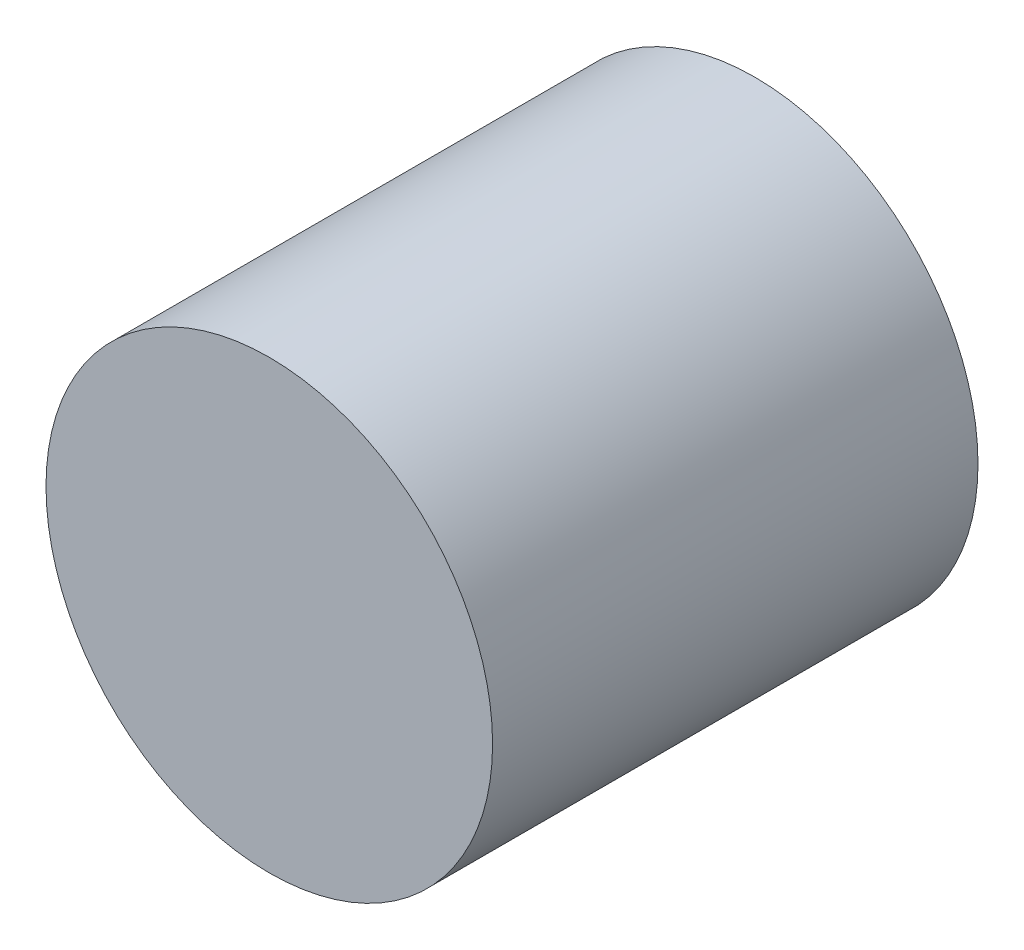
ISO-10303-21;
HEADER;
FILE_DESCRIPTION(('STEP AP214'),'2;1');
FILE_NAME('part.step','',(''),(''),'','','');
FILE_SCHEMA(('AUTOMOTIVE_DESIGN { 1 0 10303 214 1 1 1 1 }'));
ENDSEC;
DATA;
#1=APPLICATION_CONTEXT('core data for automotive mechanical design processes');
#2=APPLICATION_PROTOCOL_DEFINITION('international standard','automotive_design',2000,#1);
#3=PRODUCT_CONTEXT('',#1,'mechanical');
#4=PRODUCT('Part','Part','',(#3));
#5=PRODUCT_RELATED_PRODUCT_CATEGORY('part','',(#4));
#6=PRODUCT_DEFINITION_FORMATION('','',#4);
#7=PRODUCT_DEFINITION_CONTEXT('part definition',#1,'design');
#8=PRODUCT_DEFINITION('design','',#6,#7);
#9=PRODUCT_DEFINITION_SHAPE('','',#8);
#10=(LENGTH_UNIT() NAMED_UNIT(*) SI_UNIT(.MILLI.,.METRE.));
#11=(NAMED_UNIT(*) PLANE_ANGLE_UNIT() SI_UNIT($,.RADIAN.));
#12=(NAMED_UNIT(*) SI_UNIT($,.STERADIAN.) SOLID_ANGLE_UNIT());
#13=UNCERTAINTY_MEASURE_WITH_UNIT(LENGTH_MEASURE(1.E-05),#10,'distance_accuracy_value','');
#14=(GEOMETRIC_REPRESENTATION_CONTEXT(3) GLOBAL_UNCERTAINTY_ASSIGNED_CONTEXT((#13)) GLOBAL_UNIT_ASSIGNED_CONTEXT((#10,
#11,#12)) REPRESENTATION_CONTEXT('',''));
#15=CARTESIAN_POINT('',(0.,0.,0.));
#16=DIRECTION('',(0.,0.,1.));
#17=DIRECTION('',(1.,0.,0.));
#18=AXIS2_PLACEMENT_3D('',#15,#16,#17);
#19=CARTESIAN_POINT('',(0.,0.,5.));
#20=DIRECTION('',(0.,0.,-1.));
#21=DIRECTION('',(-1.,0.,0.));
#22=AXIS2_PLACEMENT_3D('',#19,#20,#21);
#23=CYLINDRICAL_SURFACE('',#22,2.3);
#24=CARTESIAN_POINT('',(0.,0.,5.));
#25=DIRECTION('',(0.,0.,1.));
#26=DIRECTION('',(1.,0.,0.));
#27=AXIS2_PLACEMENT_3D('',#24,#25,#26);
#28=CIRCLE('',#27,2.3);
#29=CARTESIAN_POINT('',(2.3,0.,5.));
#30=VERTEX_POINT('',#29);
#31=EDGE_CURVE('E10',#30,#30,#28,.T.);
#32=ORIENTED_EDGE('',*,*,#31,.F.);
#33=EDGE_LOOP('',(#32));
#34=FACE_BOUND('',#33,.T.);
#35=CARTESIAN_POINT('',(0.,0.,0.));
#36=DIRECTION('',(0.,0.,1.));
#37=DIRECTION('',(1.,0.,0.));
#38=AXIS2_PLACEMENT_3D('',#35,#36,#37);
#39=CIRCLE('',#38,2.3);
#40=CARTESIAN_POINT('',(2.3,0.,0.));
#41=VERTEX_POINT('',#40);
#42=EDGE_CURVE('E37',#41,#41,#39,.T.);
#43=ORIENTED_EDGE('',*,*,#42,.T.);
#44=EDGE_LOOP('',(#43));
#45=FACE_BOUND('',#44,.T.);
#46=ADVANCED_FACE('F34',(#34,#45),#23,.T.);
#47=CARTESIAN_POINT('',(0.,0.,5.));
#48=DIRECTION('',(0.,0.,1.));
#49=DIRECTION('',(1.,0.,0.));
#50=AXIS2_PLACEMENT_3D('',#47,#48,#49);
#51=PLANE('',#50);
#52=ORIENTED_EDGE('',*,*,#31,.T.);
#53=EDGE_LOOP('',(#52));
#54=FACE_BOUND('',#53,.T.);
#55=ADVANCED_FACE('F49',(#54),#51,.T.);
#56=CARTESIAN_POINT('',(0.,0.,0.));
#57=DIRECTION('',(0.,0.,1.));
#58=DIRECTION('',(1.,0.,0.));
#59=AXIS2_PLACEMENT_3D('',#56,#57,#58);
#60=PLANE('',#59);
#61=ORIENTED_EDGE('',*,*,#42,.F.);
#62=EDGE_LOOP('',(#61));
#63=FACE_BOUND('',#62,.T.);
#64=ADVANCED_FACE('F47',(#63),#60,.F.);
#65=CLOSED_SHELL('',(#46,#55,#64));
#66=MANIFOLD_SOLID_BREP('B2',#65);
#67=ADVANCED_BREP_SHAPE_REPRESENTATION('',(#18,#66),#14);
#68=SHAPE_DEFINITION_REPRESENTATION(#9,#67);
ENDSEC;
END-ISO-10303-21;
